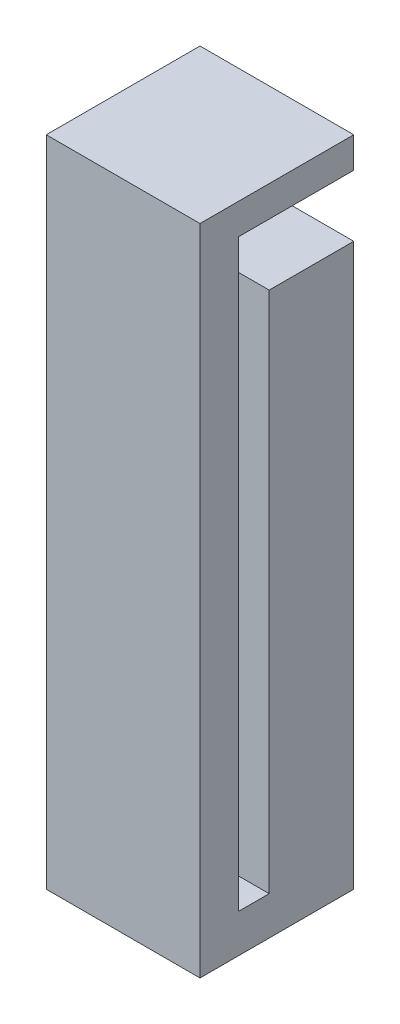
ISO-10303-21;
HEADER;
FILE_DESCRIPTION(('STEP AP214'),'2;1');
FILE_NAME('part.step','',(''),(''),'','','');
FILE_SCHEMA(('AUTOMOTIVE_DESIGN { 1 0 10303 214 1 1 1 1 }'));
ENDSEC;
DATA;
#1=APPLICATION_CONTEXT('core data for automotive mechanical design processes');
#2=APPLICATION_PROTOCOL_DEFINITION('international standard','automotive_design',2000,#1);
#3=PRODUCT_CONTEXT('',#1,'mechanical');
#4=PRODUCT('Part','Part','',(#3));
#5=PRODUCT_RELATED_PRODUCT_CATEGORY('part','',(#4));
#6=PRODUCT_DEFINITION_FORMATION('','',#4);
#7=PRODUCT_DEFINITION_CONTEXT('part definition',#1,'design');
#8=PRODUCT_DEFINITION('design','',#6,#7);
#9=PRODUCT_DEFINITION_SHAPE('','',#8);
#10=(LENGTH_UNIT() NAMED_UNIT(*) SI_UNIT(.MILLI.,.METRE.));
#11=(NAMED_UNIT(*) PLANE_ANGLE_UNIT() SI_UNIT($,.RADIAN.));
#12=(NAMED_UNIT(*) SI_UNIT($,.STERADIAN.) SOLID_ANGLE_UNIT());
#13=UNCERTAINTY_MEASURE_WITH_UNIT(LENGTH_MEASURE(1.E-05),#10,'distance_accuracy_value','');
#14=(GEOMETRIC_REPRESENTATION_CONTEXT(3) GLOBAL_UNCERTAINTY_ASSIGNED_CONTEXT((#13)) GLOBAL_UNIT_ASSIGNED_CONTEXT((#10,
#11,#12)) REPRESENTATION_CONTEXT('',''));
#15=CARTESIAN_POINT('',(0.,0.,0.));
#16=DIRECTION('',(0.,0.,1.));
#17=DIRECTION('',(1.,0.,0.));
#18=AXIS2_PLACEMENT_3D('',#15,#16,#17);
#19=CARTESIAN_POINT('',(0.,40.,-2.5));
#20=DIRECTION('',(0.,0.,-1.));
#21=DIRECTION('',(-1.,0.,0.));
#22=AXIS2_PLACEMENT_3D('',#19,#20,#21);
#23=PLANE('',#22);
#24=DIRECTION('',(1.,0.,0.));
#25=VECTOR('',#24,1.);
#26=CARTESIAN_POINT('',(0.,0.,-2.5));
#27=LINE('',#26,#25);
#28=CARTESIAN_POINT('',(6.5,0.,-2.5));
#29=VERTEX_POINT('',#28);
#30=CARTESIAN_POINT('',(10.,0.,-2.5));
#31=VERTEX_POINT('',#30);
#32=EDGE_CURVE('E251',#29,#31,#27,.T.);
#33=ORIENTED_EDGE('',*,*,#32,.F.);
#34=DIRECTION('',(0.,-1.,0.));
#35=VECTOR('',#34,1.);
#36=CARTESIAN_POINT('',(6.5,43.6568542494924,-2.5));
#37=LINE('',#36,#35);
#38=CARTESIAN_POINT('',(6.5,38.,-2.5));
#39=VERTEX_POINT('',#38);
#40=EDGE_CURVE('E181',#39,#29,#37,.T.);
#41=ORIENTED_EDGE('',*,*,#40,.F.);
#42=DIRECTION('',(-1.,0.,0.));
#43=VECTOR('',#42,1.);
#44=CARTESIAN_POINT('',(2.5,38.,-2.5));
#45=LINE('',#44,#43);
#46=CARTESIAN_POINT('',(10.,38.,-2.5));
#47=VERTEX_POINT('',#46);
#48=EDGE_CURVE('E248',#47,#39,#45,.T.);
#49=ORIENTED_EDGE('',*,*,#48,.F.);
#50=DIRECTION('',(0.,1.,0.));
#51=VECTOR('',#50,1.);
#52=CARTESIAN_POINT('',(10.,38.,-2.5));
#53=LINE('',#52,#51);
#54=EDGE_CURVE('E229',#31,#47,#53,.T.);
#55=ORIENTED_EDGE('',*,*,#54,.F.);
#56=EDGE_LOOP('',(#33,#41,#49,#55));
#57=FACE_BOUND('',#56,.T.);
#58=ADVANCED_FACE('F39',(#57),#23,.T.);
#59=CARTESIAN_POINT('',(0.,0.,0.));
#60=DIRECTION('',(0.,-1.,0.));
#61=DIRECTION('',(0.,0.,-1.));
#62=AXIS2_PLACEMENT_3D('',#59,#60,#61);
#63=PLANE('',#62);
#64=DIRECTION('',(0.,0.,-1.));
#65=VECTOR('',#64,1.);
#66=CARTESIAN_POINT('',(6.5,0.,0.));
#67=LINE('',#66,#65);
#68=CARTESIAN_POINT('',(6.5,0.,-4.5));
#69=VERTEX_POINT('',#68);
#70=EDGE_CURVE('E183',#29,#69,#67,.T.);
#71=ORIENTED_EDGE('',*,*,#70,.F.);
#72=ORIENTED_EDGE('',*,*,#32,.T.);
#73=DIRECTION('',(0.,0.,1.));
#74=VECTOR('',#73,1.);
#75=CARTESIAN_POINT('',(10.,0.,0.));
#76=LINE('',#75,#74);
#77=CARTESIAN_POINT('',(10.,0.,-4.5));
#78=VERTEX_POINT('',#77);
#79=EDGE_CURVE('E216',#78,#31,#76,.T.);
#80=ORIENTED_EDGE('',*,*,#79,.F.);
#81=DIRECTION('',(-1.,0.,0.));
#82=VECTOR('',#81,1.);
#83=CARTESIAN_POINT('',(0.,0.,-4.5));
#84=LINE('',#83,#82);
#85=EDGE_CURVE('E190',#78,#69,#84,.T.);
#86=ORIENTED_EDGE('',*,*,#85,.T.);
#87=EDGE_LOOP('',(#71,#72,#80,#86));
#88=FACE_BOUND('',#87,.T.);
#89=ADVANCED_FACE('F281',(#88),#63,.F.);
#90=CARTESIAN_POINT('',(0.,48.6066017177982,-4.5));
#91=DIRECTION('',(0.,0.,1.));
#92=DIRECTION('',(1.,0.,0.));
#93=AXIS2_PLACEMENT_3D('',#90,#91,#92);
#94=PLANE('',#93);
#95=DIRECTION('',(-1.,0.,0.));
#96=VECTOR('',#95,1.);
#97=CARTESIAN_POINT('',(2.5,34.,-4.5));
#98=LINE('',#97,#96);
#99=CARTESIAN_POINT('',(10.,34.,-4.5));
#100=VERTEX_POINT('',#99);
#101=CARTESIAN_POINT('',(6.5,34.,-4.5));
#102=VERTEX_POINT('',#101);
#103=EDGE_CURVE('E193',#100,#102,#98,.T.);
#104=ORIENTED_EDGE('',*,*,#103,.T.);
#105=DIRECTION('',(0.,-1.,0.));
#106=VECTOR('',#105,1.);
#107=CARTESIAN_POINT('',(6.5,43.6568542494924,-4.5));
#108=LINE('',#107,#106);
#109=EDGE_CURVE('E184',#102,#69,#108,.T.);
#110=ORIENTED_EDGE('',*,*,#109,.T.);
#111=ORIENTED_EDGE('',*,*,#85,.F.);
#112=DIRECTION('',(0.,-1.,0.));
#113=VECTOR('',#112,1.);
#114=CARTESIAN_POINT('',(10.,48.6066017177982,-4.5));
#115=LINE('',#114,#113);
#116=EDGE_CURVE('E194',#100,#78,#115,.T.);
#117=ORIENTED_EDGE('',*,*,#116,.F.);
#118=EDGE_LOOP('',(#104,#110,#111,#117));
#119=FACE_BOUND('',#118,.T.);
#120=ADVANCED_FACE('F284',(#119),#94,.T.);
#121=CARTESIAN_POINT('',(10.,40.,0.));
#122=DIRECTION('',(-1.,0.,0.));
#123=DIRECTION('',(0.,0.,1.));
#124=AXIS2_PLACEMENT_3D('',#121,#122,#123);
#125=PLANE('',#124);
#126=DIRECTION('',(0.,-1.,0.));
#127=VECTOR('',#126,1.);
#128=CARTESIAN_POINT('',(10.,40.,0.));
#129=LINE('',#128,#127);
#130=CARTESIAN_POINT('',(10.,40.,0.));
#131=VERTEX_POINT('',#130);
#132=CARTESIAN_POINT('',(10.,-2.5,0.));
#133=VERTEX_POINT('',#132);
#134=EDGE_CURVE('E234',#131,#133,#129,.T.);
#135=ORIENTED_EDGE('',*,*,#134,.T.);
#136=DIRECTION('',(0.,0.,1.));
#137=VECTOR('',#136,1.);
#138=CARTESIAN_POINT('',(10.,-2.5,0.));
#139=LINE('',#138,#137);
#140=CARTESIAN_POINT('',(10.,-2.5,-10.));
#141=VERTEX_POINT('',#140);
#142=EDGE_CURVE('E218',#141,#133,#139,.T.);
#143=ORIENTED_EDGE('',*,*,#142,.F.);
#144=DIRECTION('',(0.,1.,0.));
#145=VECTOR('',#144,1.);
#146=CARTESIAN_POINT('',(10.,-2.5,-10.));
#147=LINE('',#146,#145);
#148=CARTESIAN_POINT('',(10.,34.,-10.));
#149=VERTEX_POINT('',#148);
#150=EDGE_CURVE('E224',#141,#149,#147,.T.);
#151=ORIENTED_EDGE('',*,*,#150,.T.);
#152=DIRECTION('',(0.,0.,-1.));
#153=VECTOR('',#152,1.);
#154=CARTESIAN_POINT('',(10.,34.,8.49999999999999));
#155=LINE('',#154,#153);
#156=EDGE_CURVE('E208',#100,#149,#155,.T.);
#157=ORIENTED_EDGE('',*,*,#156,.F.);
#158=ORIENTED_EDGE('',*,*,#116,.T.);
#159=ORIENTED_EDGE('',*,*,#79,.T.);
#160=ORIENTED_EDGE('',*,*,#54,.T.);
#161=DIRECTION('',(0.,0.,-1.));
#162=VECTOR('',#161,1.);
#163=CARTESIAN_POINT('',(10.,38.,8.49999999999999));
#164=LINE('',#163,#162);
#165=CARTESIAN_POINT('',(10.,38.,-10.));
#166=VERTEX_POINT('',#165);
#167=EDGE_CURVE('E237',#47,#166,#164,.T.);
#168=ORIENTED_EDGE('',*,*,#167,.T.);
#169=DIRECTION('',(0.,-1.,0.));
#170=VECTOR('',#169,1.);
#171=CARTESIAN_POINT('',(10.,40.,-10.));
#172=LINE('',#171,#170);
#173=CARTESIAN_POINT('',(10.,40.,-10.));
#174=VERTEX_POINT('',#173);
#175=EDGE_CURVE('E260',#174,#166,#172,.T.);
#176=ORIENTED_EDGE('',*,*,#175,.F.);
#177=DIRECTION('',(0.,0.,-1.));
#178=VECTOR('',#177,1.);
#179=CARTESIAN_POINT('',(10.,40.,0.));
#180=LINE('',#179,#178);
#181=EDGE_CURVE('E242',#131,#174,#180,.T.);
#182=ORIENTED_EDGE('',*,*,#181,.F.);
#183=EDGE_LOOP('',(#135,#143,#151,#157,#158,#159,#160,#168,#176,#182));
#184=FACE_BOUND('',#183,.T.);
#185=ADVANCED_FACE('F41',(#184),#125,.F.);
#186=CARTESIAN_POINT('',(0.,40.,-10.));
#187=DIRECTION('',(0.,0.,1.));
#188=DIRECTION('',(1.,0.,0.));
#189=AXIS2_PLACEMENT_3D('',#186,#187,#188);
#190=PLANE('',#189);
#191=DIRECTION('',(1.,0.,0.));
#192=VECTOR('',#191,1.);
#193=CARTESIAN_POINT('',(2.5,38.,-10.));
#194=LINE('',#193,#192);
#195=CARTESIAN_POINT('',(2.5,38.,-10.));
#196=VERTEX_POINT('',#195);
#197=EDGE_CURVE('E239',#196,#166,#194,.T.);
#198=ORIENTED_EDGE('',*,*,#197,.F.);
#199=DIRECTION('',(0.,-1.,0.));
#200=VECTOR('',#199,1.);
#201=CARTESIAN_POINT('',(2.5,48.6066017177982,-10.));
#202=LINE('',#201,#200);
#203=CARTESIAN_POINT('',(2.5,0.,-10.));
#204=VERTEX_POINT('',#203);
#205=EDGE_CURVE('E236',#196,#204,#202,.T.);
#206=ORIENTED_EDGE('',*,*,#205,.T.);
#207=DIRECTION('',(1.,0.,0.));
#208=VECTOR('',#207,1.);
#209=CARTESIAN_POINT('',(0.,0.,-10.));
#210=LINE('',#209,#208);
#211=CARTESIAN_POINT('',(4.5,0.,-10.));
#212=VERTEX_POINT('',#211);
#213=EDGE_CURVE('E211',#204,#212,#210,.T.);
#214=ORIENTED_EDGE('',*,*,#213,.T.);
#215=DIRECTION('',(0.,-1.,0.));
#216=VECTOR('',#215,1.);
#217=CARTESIAN_POINT('',(4.5,48.6066017177982,-10.));
#218=LINE('',#217,#216);
#219=CARTESIAN_POINT('',(4.5,34.,-10.));
#220=VERTEX_POINT('',#219);
#221=EDGE_CURVE('E189',#220,#212,#218,.T.);
#222=ORIENTED_EDGE('',*,*,#221,.F.);
#223=DIRECTION('',(-1.,0.,0.));
#224=VECTOR('',#223,1.);
#225=CARTESIAN_POINT('',(2.5,34.,-10.));
#226=LINE('',#225,#224);
#227=EDGE_CURVE('E205',#149,#220,#226,.T.);
#228=ORIENTED_EDGE('',*,*,#227,.F.);
#229=ORIENTED_EDGE('',*,*,#150,.F.);
#230=DIRECTION('',(1.,0.,0.));
#231=VECTOR('',#230,1.);
#232=CARTESIAN_POINT('',(0.,-2.5,-10.));
#233=LINE('',#232,#231);
#234=CARTESIAN_POINT('',(0.,-2.5,-10.));
#235=VERTEX_POINT('',#234);
#236=EDGE_CURVE('E215',#235,#141,#233,.T.);
#237=ORIENTED_EDGE('',*,*,#236,.F.);
#238=DIRECTION('',(0.,-1.,0.));
#239=VECTOR('',#238,1.);
#240=CARTESIAN_POINT('',(0.,40.,-10.));
#241=LINE('',#240,#239);
#242=CARTESIAN_POINT('',(0.,40.,-10.));
#243=VERTEX_POINT('',#242);
#244=EDGE_CURVE('E233',#243,#235,#241,.T.);
#245=ORIENTED_EDGE('',*,*,#244,.F.);
#246=DIRECTION('',(-1.,0.,0.));
#247=VECTOR('',#246,1.);
#248=CARTESIAN_POINT('',(0.,40.,-10.));
#249=LINE('',#248,#247);
#250=EDGE_CURVE('E240',#174,#243,#249,.T.);
#251=ORIENTED_EDGE('',*,*,#250,.F.);
#252=ORIENTED_EDGE('',*,*,#175,.T.);
#253=EDGE_LOOP('',(#198,#206,#214,#222,#228,#229,#237,#245,#251,#252));
#254=FACE_BOUND('',#253,.T.);
#255=ADVANCED_FACE('F267',(#254),#190,.F.);
#256=CARTESIAN_POINT('',(2.5,38.,8.49999999999999));
#257=DIRECTION('',(0.,1.,0.));
#258=DIRECTION('',(0.,0.,1.));
#259=AXIS2_PLACEMENT_3D('',#256,#257,#258);
#260=PLANE('',#259);
#261=DIRECTION('',(0.,0.,-1.));
#262=VECTOR('',#261,1.);
#263=CARTESIAN_POINT('',(4.5,38.,0.));
#264=LINE('',#263,#262);
#265=CARTESIAN_POINT('',(4.5,38.,-4.5));
#266=VERTEX_POINT('',#265);
#267=CARTESIAN_POINT('',(4.5,38.,-6.5));
#268=VERTEX_POINT('',#267);
#269=EDGE_CURVE('E162',#266,#268,#264,.T.);
#270=ORIENTED_EDGE('',*,*,#269,.T.);
#271=DIRECTION('',(1.,0.,0.));
#272=VECTOR('',#271,1.);
#273=CARTESIAN_POINT('',(0.,38.,-6.5));
#274=LINE('',#273,#272);
#275=CARTESIAN_POINT('',(2.5,38.,-6.5));
#276=VERTEX_POINT('',#275);
#277=EDGE_CURVE('E176',#276,#268,#274,.T.);
#278=ORIENTED_EDGE('',*,*,#277,.F.);
#279=DIRECTION('',(0.,0.,-1.));
#280=VECTOR('',#279,1.);
#281=CARTESIAN_POINT('',(2.5,38.,8.49999999999999));
#282=LINE('',#281,#280);
#283=EDGE_CURVE('E250',#276,#196,#282,.T.);
#284=ORIENTED_EDGE('',*,*,#283,.T.);
#285=ORIENTED_EDGE('',*,*,#197,.T.);
#286=ORIENTED_EDGE('',*,*,#167,.F.);
#287=ORIENTED_EDGE('',*,*,#48,.T.);
#288=DIRECTION('',(0.,0.,-1.));
#289=VECTOR('',#288,1.);
#290=CARTESIAN_POINT('',(6.5,38.,0.));
#291=LINE('',#290,#289);
#292=CARTESIAN_POINT('',(6.5,38.,-4.5));
#293=VERTEX_POINT('',#292);
#294=EDGE_CURVE('E170',#39,#293,#291,.T.);
#295=ORIENTED_EDGE('',*,*,#294,.T.);
#296=DIRECTION('',(-1.,0.,0.));
#297=VECTOR('',#296,1.);
#298=CARTESIAN_POINT('',(0.,38.,-4.5));
#299=LINE('',#298,#297);
#300=EDGE_CURVE('E152',#293,#266,#299,.T.);
#301=ORIENTED_EDGE('',*,*,#300,.T.);
#302=EDGE_LOOP('',(#270,#278,#284,#285,#286,#287,#295,#301));
#303=FACE_BOUND('',#302,.T.);
#304=ADVANCED_FACE('F168',(#303),#260,.F.);
#305=CARTESIAN_POINT('',(0.,40.,0.));
#306=DIRECTION('',(1.,0.,0.));
#307=DIRECTION('',(0.,0.,-1.));
#308=AXIS2_PLACEMENT_3D('',#305,#306,#307);
#309=PLANE('',#308);
#310=ORIENTED_EDGE('',*,*,#244,.T.);
#311=DIRECTION('',(0.,0.,-1.));
#312=VECTOR('',#311,1.);
#313=CARTESIAN_POINT('',(0.,-2.5,0.));
#314=LINE('',#313,#312);
#315=CARTESIAN_POINT('',(0.,-2.5,0.));
#316=VERTEX_POINT('',#315);
#317=EDGE_CURVE('E212',#316,#235,#314,.T.);
#318=ORIENTED_EDGE('',*,*,#317,.F.);
#319=DIRECTION('',(0.,-1.,0.));
#320=VECTOR('',#319,1.);
#321=CARTESIAN_POINT('',(0.,40.,0.));
#322=LINE('',#321,#320);
#323=CARTESIAN_POINT('',(0.,40.,0.));
#324=VERTEX_POINT('',#323);
#325=EDGE_CURVE('E230',#324,#316,#322,.T.);
#326=ORIENTED_EDGE('',*,*,#325,.F.);
#327=DIRECTION('',(0.,0.,1.));
#328=VECTOR('',#327,1.);
#329=CARTESIAN_POINT('',(0.,40.,0.));
#330=LINE('',#329,#328);
#331=EDGE_CURVE('E232',#243,#324,#330,.T.);
#332=ORIENTED_EDGE('',*,*,#331,.F.);
#333=EDGE_LOOP('',(#310,#318,#326,#332));
#334=FACE_BOUND('',#333,.T.);
#335=ADVANCED_FACE('F310',(#334),#309,.F.);
#336=CARTESIAN_POINT('',(0.,40.,0.));
#337=DIRECTION('',(0.,0.,-1.));
#338=DIRECTION('',(-1.,0.,0.));
#339=AXIS2_PLACEMENT_3D('',#336,#337,#338);
#340=PLANE('',#339);
#341=ORIENTED_EDGE('',*,*,#325,.T.);
#342=DIRECTION('',(-1.,0.,0.));
#343=VECTOR('',#342,1.);
#344=CARTESIAN_POINT('',(0.,-2.5,0.));
#345=LINE('',#344,#343);
#346=EDGE_CURVE('E221',#133,#316,#345,.T.);
#347=ORIENTED_EDGE('',*,*,#346,.F.);
#348=ORIENTED_EDGE('',*,*,#134,.F.);
#349=DIRECTION('',(1.,0.,0.));
#350=VECTOR('',#349,1.);
#351=CARTESIAN_POINT('',(0.,40.,0.));
#352=LINE('',#351,#350);
#353=EDGE_CURVE('E244',#324,#131,#352,.T.);
#354=ORIENTED_EDGE('',*,*,#353,.F.);
#355=EDGE_LOOP('',(#341,#347,#348,#354));
#356=FACE_BOUND('',#355,.T.);
#357=ADVANCED_FACE('F315',(#356),#340,.F.);
#358=CARTESIAN_POINT('',(0.,40.,0.));
#359=DIRECTION('',(0.,-1.,0.));
#360=DIRECTION('',(0.,0.,-1.));
#361=AXIS2_PLACEMENT_3D('',#358,#359,#360);
#362=PLANE('',#361);
#363=ORIENTED_EDGE('',*,*,#331,.T.);
#364=ORIENTED_EDGE('',*,*,#353,.T.);
#365=ORIENTED_EDGE('',*,*,#181,.T.);
#366=ORIENTED_EDGE('',*,*,#250,.T.);
#367=EDGE_LOOP('',(#363,#364,#365,#366));
#368=FACE_BOUND('',#367,.T.);
#369=ADVANCED_FACE('F312',(#368),#362,.F.);
#370=CARTESIAN_POINT('',(2.5,38.,8.49999999999999));
#371=DIRECTION('',(-1.,0.,0.));
#372=DIRECTION('',(0.,0.,1.));
#373=AXIS2_PLACEMENT_3D('',#370,#371,#372);
#374=PLANE('',#373);
#375=ORIENTED_EDGE('',*,*,#283,.F.);
#376=DIRECTION('',(0.,-1.,0.));
#377=VECTOR('',#376,1.);
#378=CARTESIAN_POINT('',(2.5,43.6568542494924,-6.5));
#379=LINE('',#378,#377);
#380=CARTESIAN_POINT('',(2.5,0.,-6.5));
#381=VERTEX_POINT('',#380);
#382=EDGE_CURVE('E178',#276,#381,#379,.T.);
#383=ORIENTED_EDGE('',*,*,#382,.T.);
#384=DIRECTION('',(0.,0.,-1.));
#385=VECTOR('',#384,1.);
#386=CARTESIAN_POINT('',(2.5,0.,0.));
#387=LINE('',#386,#385);
#388=EDGE_CURVE('E47',#381,#204,#387,.T.);
#389=ORIENTED_EDGE('',*,*,#388,.T.);
#390=ORIENTED_EDGE('',*,*,#205,.F.);
#391=EDGE_LOOP('',(#375,#383,#389,#390));
#392=FACE_BOUND('',#391,.T.);
#393=ADVANCED_FACE('F298',(#392),#374,.F.);
#394=CARTESIAN_POINT('',(0.,-2.5,0.));
#395=DIRECTION('',(0.,-1.,0.));
#396=DIRECTION('',(0.,0.,-1.));
#397=AXIS2_PLACEMENT_3D('',#394,#395,#396);
#398=PLANE('',#397);
#399=ORIENTED_EDGE('',*,*,#317,.T.);
#400=ORIENTED_EDGE('',*,*,#236,.T.);
#401=ORIENTED_EDGE('',*,*,#142,.T.);
#402=ORIENTED_EDGE('',*,*,#346,.T.);
#403=EDGE_LOOP('',(#399,#400,#401,#402));
#404=FACE_BOUND('',#403,.T.);
#405=ADVANCED_FACE('F306',(#404),#398,.T.);
#406=ORIENTED_EDGE('',*,*,#388,.F.);
#407=DIRECTION('',(1.,0.,0.));
#408=VECTOR('',#407,1.);
#409=CARTESIAN_POINT('',(0.,0.,-6.5));
#410=LINE('',#409,#408);
#411=CARTESIAN_POINT('',(4.5,0.,-6.5));
#412=VERTEX_POINT('',#411);
#413=EDGE_CURVE('E158',#381,#412,#410,.T.);
#414=ORIENTED_EDGE('',*,*,#413,.T.);
#415=DIRECTION('',(0.,0.,1.));
#416=VECTOR('',#415,1.);
#417=CARTESIAN_POINT('',(4.5,0.,0.));
#418=LINE('',#417,#416);
#419=EDGE_CURVE('E62',#212,#412,#418,.T.);
#420=ORIENTED_EDGE('',*,*,#419,.F.);
#421=ORIENTED_EDGE('',*,*,#213,.F.);
#422=EDGE_LOOP('',(#406,#414,#420,#421));
#423=FACE_BOUND('',#422,.T.);
#424=ADVANCED_FACE('F294',(#423),#63,.F.);
#425=CARTESIAN_POINT('',(2.5,34.,8.49999999999999));
#426=DIRECTION('',(0.,-1.,0.));
#427=DIRECTION('',(0.,0.,-1.));
#428=AXIS2_PLACEMENT_3D('',#425,#426,#427);
#429=PLANE('',#428);
#430=ORIENTED_EDGE('',*,*,#227,.T.);
#431=DIRECTION('',(0.,0.,1.));
#432=VECTOR('',#431,1.);
#433=CARTESIAN_POINT('',(4.5,34.,8.49999999999999));
#434=LINE('',#433,#432);
#435=CARTESIAN_POINT('',(4.5,34.,-6.5));
#436=VERTEX_POINT('',#435);
#437=EDGE_CURVE('E202',#220,#436,#434,.T.);
#438=ORIENTED_EDGE('',*,*,#437,.T.);
#439=CARTESIAN_POINT('',(4.5,34.,-4.5));
#440=VERTEX_POINT('',#439);
#441=EDGE_CURVE('E201',#436,#440,#434,.T.);
#442=ORIENTED_EDGE('',*,*,#441,.T.);
#443=DIRECTION('',(-1.,0.,0.));
#444=VECTOR('',#443,1.);
#445=CARTESIAN_POINT('',(2.5,34.,-4.5));
#446=LINE('',#445,#444);
#447=EDGE_CURVE('E155',#102,#440,#446,.T.);
#448=ORIENTED_EDGE('',*,*,#447,.F.);
#449=ORIENTED_EDGE('',*,*,#103,.F.);
#450=ORIENTED_EDGE('',*,*,#156,.T.);
#451=EDGE_LOOP('',(#430,#438,#442,#448,#449,#450));
#452=FACE_BOUND('',#451,.T.);
#453=ADVANCED_FACE('F287',(#452),#429,.F.);
#454=CARTESIAN_POINT('',(4.5,48.6066017177982,0.));
#455=DIRECTION('',(1.,0.,0.));
#456=DIRECTION('',(0.,0.,-1.));
#457=AXIS2_PLACEMENT_3D('',#454,#455,#456);
#458=PLANE('',#457);
#459=ORIENTED_EDGE('',*,*,#419,.T.);
#460=DIRECTION('',(0.,1.,0.));
#461=VECTOR('',#460,1.);
#462=CARTESIAN_POINT('',(4.5,48.6066017177982,-6.5));
#463=LINE('',#462,#461);
#464=EDGE_CURVE('E11',#412,#436,#463,.T.);
#465=ORIENTED_EDGE('',*,*,#464,.T.);
#466=ORIENTED_EDGE('',*,*,#437,.F.);
#467=ORIENTED_EDGE('',*,*,#221,.T.);
#468=EDGE_LOOP('',(#459,#465,#466,#467));
#469=FACE_BOUND('',#468,.T.);
#470=ADVANCED_FACE('F290',(#469),#458,.F.);
#471=CARTESIAN_POINT('',(4.5,43.6568542494924,0.));
#472=DIRECTION('',(-1.,0.,0.));
#473=DIRECTION('',(0.,0.,1.));
#474=AXIS2_PLACEMENT_3D('',#471,#472,#473);
#475=PLANE('',#474);
#476=DIRECTION('',(0.,-1.,0.));
#477=VECTOR('',#476,1.);
#478=CARTESIAN_POINT('',(4.5,43.6568542494924,-4.5));
#479=LINE('',#478,#477);
#480=EDGE_CURVE('E147',#266,#440,#479,.T.);
#481=ORIENTED_EDGE('',*,*,#480,.T.);
#482=ORIENTED_EDGE('',*,*,#441,.F.);
#483=DIRECTION('',(0.,-1.,0.));
#484=VECTOR('',#483,1.);
#485=CARTESIAN_POINT('',(4.5,43.6568542494924,-6.5));
#486=LINE('',#485,#484);
#487=EDGE_CURVE('E54',#268,#436,#486,.T.);
#488=ORIENTED_EDGE('',*,*,#487,.F.);
#489=ORIENTED_EDGE('',*,*,#269,.F.);
#490=EDGE_LOOP('',(#481,#482,#488,#489));
#491=FACE_BOUND('',#490,.T.);
#492=ADVANCED_FACE('F163',(#491),#475,.F.);
#493=CARTESIAN_POINT('',(0.,43.6568542494924,-4.5));
#494=DIRECTION('',(0.,0.,1.));
#495=DIRECTION('',(1.,0.,0.));
#496=AXIS2_PLACEMENT_3D('',#493,#494,#495);
#497=PLANE('',#496);
#498=EDGE_CURVE('E159',#293,#102,#108,.T.);
#499=ORIENTED_EDGE('',*,*,#498,.T.);
#500=ORIENTED_EDGE('',*,*,#447,.T.);
#501=ORIENTED_EDGE('',*,*,#480,.F.);
#502=ORIENTED_EDGE('',*,*,#300,.F.);
#503=EDGE_LOOP('',(#499,#500,#501,#502));
#504=FACE_BOUND('',#503,.T.);
#505=ADVANCED_FACE('F150',(#504),#497,.F.);
#506=CARTESIAN_POINT('',(0.,43.6568542494924,-6.5));
#507=DIRECTION('',(0.,0.,-1.));
#508=DIRECTION('',(-1.,0.,0.));
#509=AXIS2_PLACEMENT_3D('',#506,#507,#508);
#510=PLANE('',#509);
#511=ORIENTED_EDGE('',*,*,#382,.F.);
#512=ORIENTED_EDGE('',*,*,#277,.T.);
#513=ORIENTED_EDGE('',*,*,#487,.T.);
#514=ORIENTED_EDGE('',*,*,#464,.F.);
#515=ORIENTED_EDGE('',*,*,#413,.F.);
#516=EDGE_LOOP('',(#511,#512,#513,#514,#515));
#517=FACE_BOUND('',#516,.T.);
#518=ADVANCED_FACE('F292',(#517),#510,.T.);
#519=CARTESIAN_POINT('',(6.5,43.6568542494924,0.));
#520=DIRECTION('',(-1.,0.,0.));
#521=DIRECTION('',(0.,0.,1.));
#522=AXIS2_PLACEMENT_3D('',#519,#520,#521);
#523=PLANE('',#522);
#524=ORIENTED_EDGE('',*,*,#294,.F.);
#525=ORIENTED_EDGE('',*,*,#40,.T.);
#526=ORIENTED_EDGE('',*,*,#70,.T.);
#527=ORIENTED_EDGE('',*,*,#109,.F.);
#528=ORIENTED_EDGE('',*,*,#498,.F.);
#529=EDGE_LOOP('',(#524,#525,#526,#527,#528));
#530=FACE_BOUND('',#529,.T.);
#531=ADVANCED_FACE('F278',(#530),#523,.F.);
#532=CLOSED_SHELL('',(#58,#89,#120,#185,#255,#304,#335,#357,#369,#393,#405,#424,#453,#470,#492,
#505,#518,#531));
#533=MANIFOLD_SOLID_BREP('B2',#532);
#534=ADVANCED_BREP_SHAPE_REPRESENTATION('',(#18,#533),#14);
#535=SHAPE_DEFINITION_REPRESENTATION(#9,#534);
ENDSEC;
END-ISO-10303-21;
